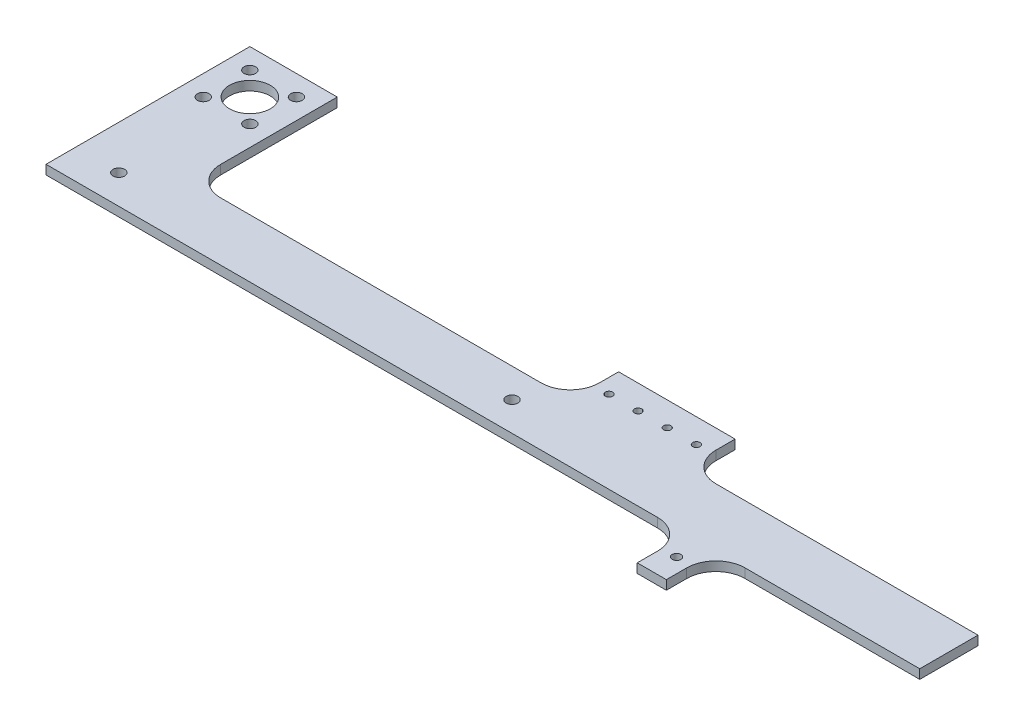
ISO-10303-21;
HEADER;
FILE_DESCRIPTION(('STEP AP214'),'2;1');
FILE_NAME('part.step','',(''),(''),'','','');
FILE_SCHEMA(('AUTOMOTIVE_DESIGN { 1 0 10303 214 1 1 1 1 }'));
ENDSEC;
DATA;
#1=APPLICATION_CONTEXT('core data for automotive mechanical design processes');
#2=APPLICATION_PROTOCOL_DEFINITION('international standard','automotive_design',2000,#1);
#3=PRODUCT_CONTEXT('',#1,'mechanical');
#4=PRODUCT('Part','Part','',(#3));
#5=PRODUCT_RELATED_PRODUCT_CATEGORY('part','',(#4));
#6=PRODUCT_DEFINITION_FORMATION('','',#4);
#7=PRODUCT_DEFINITION_CONTEXT('part definition',#1,'design');
#8=PRODUCT_DEFINITION('design','',#6,#7);
#9=PRODUCT_DEFINITION_SHAPE('','',#8);
#10=(LENGTH_UNIT() NAMED_UNIT(*) SI_UNIT(.MILLI.,.METRE.));
#11=(NAMED_UNIT(*) PLANE_ANGLE_UNIT() SI_UNIT($,.RADIAN.));
#12=(NAMED_UNIT(*) SI_UNIT($,.STERADIAN.) SOLID_ANGLE_UNIT());
#13=UNCERTAINTY_MEASURE_WITH_UNIT(LENGTH_MEASURE(1.E-05),#10,'distance_accuracy_value','');
#14=(GEOMETRIC_REPRESENTATION_CONTEXT(3) GLOBAL_UNCERTAINTY_ASSIGNED_CONTEXT((#13)) GLOBAL_UNIT_ASSIGNED_CONTEXT((#10,
#11,#12)) REPRESENTATION_CONTEXT('',''));
#15=CARTESIAN_POINT('',(0.,0.,0.));
#16=DIRECTION('',(0.,0.,1.));
#17=DIRECTION('',(1.,0.,0.));
#18=AXIS2_PLACEMENT_3D('',#15,#16,#17);
#19=CARTESIAN_POINT('',(230.,3.175,0.));
#20=DIRECTION('',(-1.,0.,0.));
#21=DIRECTION('',(0.,0.,1.));
#22=AXIS2_PLACEMENT_3D('',#19,#20,#21);
#23=PLANE('',#22);
#24=DIRECTION('',(0.,0.,-1.));
#25=VECTOR('',#24,1.);
#26=CARTESIAN_POINT('',(230.,0.,0.));
#27=LINE('',#26,#25);
#28=CARTESIAN_POINT('',(230.,0.,17.));
#29=VERTEX_POINT('',#28);
#30=CARTESIAN_POINT('',(230.,0.,10.));
#31=VERTEX_POINT('',#30);
#32=EDGE_CURVE('E289',#29,#31,#27,.T.);
#33=ORIENTED_EDGE('',*,*,#32,.T.);
#34=DIRECTION('',(0.,-1.,0.));
#35=VECTOR('',#34,1.);
#36=CARTESIAN_POINT('',(230.,3.175,10.));
#37=LINE('',#36,#35);
#38=CARTESIAN_POINT('',(230.,3.175,10.));
#39=VERTEX_POINT('',#38);
#40=EDGE_CURVE('E56',#31,#39,#37,.F.);
#41=ORIENTED_EDGE('',*,*,#40,.T.);
#42=DIRECTION('',(0.,0.,-1.));
#43=VECTOR('',#42,1.);
#44=CARTESIAN_POINT('',(230.,3.175,0.));
#45=LINE('',#44,#43);
#46=CARTESIAN_POINT('',(230.,3.175,17.));
#47=VERTEX_POINT('',#46);
#48=EDGE_CURVE('E224',#47,#39,#45,.T.);
#49=ORIENTED_EDGE('',*,*,#48,.F.);
#50=DIRECTION('',(0.,-1.,0.));
#51=VECTOR('',#50,1.);
#52=CARTESIAN_POINT('',(230.,3.175,17.));
#53=LINE('',#52,#51);
#54=EDGE_CURVE('E262',#47,#29,#53,.T.);
#55=ORIENTED_EDGE('',*,*,#54,.T.);
#56=EDGE_LOOP('',(#33,#41,#49,#55));
#57=FACE_BOUND('',#56,.T.);
#58=ADVANCED_FACE('F35',(#57),#23,.F.);
#59=CARTESIAN_POINT('',(200.,3.175,0.));
#60=DIRECTION('',(-1.,0.,0.));
#61=DIRECTION('',(0.,0.,1.));
#62=AXIS2_PLACEMENT_3D('',#59,#60,#61);
#63=PLANE('',#62);
#64=DIRECTION('',(0.,0.,-1.));
#65=VECTOR('',#64,1.);
#66=CARTESIAN_POINT('',(200.,3.175,0.));
#67=LINE('',#66,#65);
#68=CARTESIAN_POINT('',(200.,3.175,-30.));
#69=VERTEX_POINT('',#68);
#70=CARTESIAN_POINT('',(200.,3.175,-36.6));
#71=VERTEX_POINT('',#70);
#72=EDGE_CURVE('E197',#69,#71,#67,.T.);
#73=ORIENTED_EDGE('',*,*,#72,.F.);
#74=DIRECTION('',(0.,-1.,0.));
#75=VECTOR('',#74,1.);
#76=CARTESIAN_POINT('',(200.,3.175,-30.));
#77=LINE('',#76,#75);
#78=CARTESIAN_POINT('',(200.,0.,-30.));
#79=VERTEX_POINT('',#78);
#80=EDGE_CURVE('E348',#69,#79,#77,.T.);
#81=ORIENTED_EDGE('',*,*,#80,.T.);
#82=DIRECTION('',(0.,0.,-1.));
#83=VECTOR('',#82,1.);
#84=CARTESIAN_POINT('',(200.,0.,0.));
#85=LINE('',#84,#83);
#86=CARTESIAN_POINT('',(200.,0.,-36.6));
#87=VERTEX_POINT('',#86);
#88=EDGE_CURVE('E186',#79,#87,#85,.T.);
#89=ORIENTED_EDGE('',*,*,#88,.T.);
#90=DIRECTION('',(0.,-1.,0.));
#91=VECTOR('',#90,1.);
#92=CARTESIAN_POINT('',(200.,3.175,-36.6));
#93=LINE('',#92,#91);
#94=EDGE_CURVE('E340',#71,#87,#93,.T.);
#95=ORIENTED_EDGE('',*,*,#94,.F.);
#96=EDGE_LOOP('',(#73,#81,#89,#95));
#97=FACE_BOUND('',#96,.T.);
#98=ADVANCED_FACE('F395',(#97),#63,.F.);
#99=CARTESIAN_POINT('',(0.,3.175,-36.6));
#100=DIRECTION('',(0.,0.,1.));
#101=DIRECTION('',(1.,0.,0.));
#102=AXIS2_PLACEMENT_3D('',#99,#100,#101);
#103=PLANE('',#102);
#104=DIRECTION('',(-1.,0.,0.));
#105=VECTOR('',#104,1.);
#106=CARTESIAN_POINT('',(0.,0.,-36.6));
#107=LINE('',#106,#105);
#108=CARTESIAN_POINT('',(160.,0.,-36.6));
#109=VERTEX_POINT('',#108);
#110=EDGE_CURVE('E264',#87,#109,#107,.T.);
#111=ORIENTED_EDGE('',*,*,#110,.T.);
#112=DIRECTION('',(0.,-1.,0.));
#113=VECTOR('',#112,1.);
#114=CARTESIAN_POINT('',(160.,3.175,-36.6));
#115=LINE('',#114,#113);
#116=CARTESIAN_POINT('',(160.,3.175,-36.6));
#117=VERTEX_POINT('',#116);
#118=EDGE_CURVE('E337',#117,#109,#115,.T.);
#119=ORIENTED_EDGE('',*,*,#118,.F.);
#120=DIRECTION('',(-1.,0.,0.));
#121=VECTOR('',#120,1.);
#122=CARTESIAN_POINT('',(0.,3.175,-36.6));
#123=LINE('',#122,#121);
#124=EDGE_CURVE('E199',#71,#117,#123,.T.);
#125=ORIENTED_EDGE('',*,*,#124,.F.);
#126=ORIENTED_EDGE('',*,*,#94,.T.);
#127=EDGE_LOOP('',(#111,#119,#125,#126));
#128=FACE_BOUND('',#127,.T.);
#129=ADVANCED_FACE('F402',(#128),#103,.F.);
#130=CARTESIAN_POINT('',(160.,3.175,0.));
#131=DIRECTION('',(1.,0.,0.));
#132=DIRECTION('',(0.,0.,-1.));
#133=AXIS2_PLACEMENT_3D('',#130,#131,#132);
#134=PLANE('',#133);
#135=DIRECTION('',(0.,0.,1.));
#136=VECTOR('',#135,1.);
#137=CARTESIAN_POINT('',(160.,0.,0.));
#138=LINE('',#137,#136);
#139=CARTESIAN_POINT('',(160.,0.,-30.));
#140=VERTEX_POINT('',#139);
#141=EDGE_CURVE('E266',#109,#140,#138,.T.);
#142=ORIENTED_EDGE('',*,*,#141,.T.);
#143=DIRECTION('',(0.,-1.,0.));
#144=VECTOR('',#143,1.);
#145=CARTESIAN_POINT('',(160.,3.175,-30.));
#146=LINE('',#145,#144);
#147=CARTESIAN_POINT('',(160.,3.175,-30.));
#148=VERTEX_POINT('',#147);
#149=EDGE_CURVE('E358',#140,#148,#146,.F.);
#150=ORIENTED_EDGE('',*,*,#149,.T.);
#151=DIRECTION('',(0.,0.,1.));
#152=VECTOR('',#151,1.);
#153=CARTESIAN_POINT('',(160.,3.175,0.));
#154=LINE('',#153,#152);
#155=EDGE_CURVE('E202',#117,#148,#154,.T.);
#156=ORIENTED_EDGE('',*,*,#155,.F.);
#157=ORIENTED_EDGE('',*,*,#118,.T.);
#158=EDGE_LOOP('',(#142,#150,#156,#157));
#159=FACE_BOUND('',#158,.T.);
#160=ADVANCED_FACE('F480',(#159),#134,.F.);
#161=CARTESIAN_POINT('',(0.,3.175,-20.));
#162=DIRECTION('',(0.,0.,-1.));
#163=DIRECTION('',(-1.,0.,0.));
#164=AXIS2_PLACEMENT_3D('',#161,#162,#163);
#165=PLANE('',#164);
#166=DIRECTION('',(1.,0.,0.));
#167=VECTOR('',#166,1.);
#168=CARTESIAN_POINT('',(0.,3.175,-20.));
#169=LINE('',#168,#167);
#170=CARTESIAN_POINT('',(40.,3.175,-20.));
#171=VERTEX_POINT('',#170);
#172=CARTESIAN_POINT('',(150.,3.175,-20.));
#173=VERTEX_POINT('',#172);
#174=EDGE_CURVE('E205',#171,#173,#169,.T.);
#175=ORIENTED_EDGE('',*,*,#174,.T.);
#176=DIRECTION('',(0.,-1.,0.));
#177=VECTOR('',#176,1.);
#178=CARTESIAN_POINT('',(150.,3.175,-20.));
#179=LINE('',#178,#177);
#180=CARTESIAN_POINT('',(150.,0.,-20.));
#181=VERTEX_POINT('',#180);
#182=EDGE_CURVE('E355',#173,#181,#179,.T.);
#183=ORIENTED_EDGE('',*,*,#182,.T.);
#184=DIRECTION('',(1.,0.,0.));
#185=VECTOR('',#184,1.);
#186=CARTESIAN_POINT('',(0.,0.,-20.));
#187=LINE('',#186,#185);
#188=CARTESIAN_POINT('',(40.,0.,-20.));
#189=VERTEX_POINT('',#188);
#190=EDGE_CURVE('E269',#189,#181,#187,.T.);
#191=ORIENTED_EDGE('',*,*,#190,.F.);
#192=DIRECTION('',(0.,-1.,0.));
#193=VECTOR('',#192,1.);
#194=CARTESIAN_POINT('',(40.,3.175,-20.));
#195=LINE('',#194,#193);
#196=EDGE_CURVE('E353',#189,#171,#195,.F.);
#197=ORIENTED_EDGE('',*,*,#196,.T.);
#198=EDGE_LOOP('',(#175,#183,#191,#197));
#199=FACE_BOUND('',#198,.T.);
#200=ADVANCED_FACE('F413',(#199),#165,.T.);
#201=CARTESIAN_POINT('',(30.,3.175,0.));
#202=DIRECTION('',(-1.,0.,0.));
#203=DIRECTION('',(0.,0.,1.));
#204=AXIS2_PLACEMENT_3D('',#201,#202,#203);
#205=PLANE('',#204);
#206=DIRECTION('',(0.,0.,-1.));
#207=VECTOR('',#206,1.);
#208=CARTESIAN_POINT('',(30.,3.175,0.));
#209=LINE('',#208,#207);
#210=CARTESIAN_POINT('',(30.,3.175,-30.));
#211=VERTEX_POINT('',#210);
#212=CARTESIAN_POINT('',(30.,3.175,-70.));
#213=VERTEX_POINT('',#212);
#214=EDGE_CURVE('E208',#211,#213,#209,.T.);
#215=ORIENTED_EDGE('',*,*,#214,.F.);
#216=DIRECTION('',(0.,-1.,0.));
#217=VECTOR('',#216,1.);
#218=CARTESIAN_POINT('',(30.,3.175,-30.));
#219=LINE('',#218,#217);
#220=CARTESIAN_POINT('',(30.,0.,-30.));
#221=VERTEX_POINT('',#220);
#222=EDGE_CURVE('E360',#211,#221,#219,.T.);
#223=ORIENTED_EDGE('',*,*,#222,.T.);
#224=DIRECTION('',(0.,0.,-1.));
#225=VECTOR('',#224,1.);
#226=CARTESIAN_POINT('',(30.,0.,0.));
#227=LINE('',#226,#225);
#228=CARTESIAN_POINT('',(30.,0.,-70.));
#229=VERTEX_POINT('',#228);
#230=EDGE_CURVE('E272',#221,#229,#227,.T.);
#231=ORIENTED_EDGE('',*,*,#230,.T.);
#232=DIRECTION('',(0.,-1.,0.));
#233=VECTOR('',#232,1.);
#234=CARTESIAN_POINT('',(30.,3.175,-70.));
#235=LINE('',#234,#233);
#236=EDGE_CURVE('E334',#213,#229,#235,.T.);
#237=ORIENTED_EDGE('',*,*,#236,.F.);
#238=EDGE_LOOP('',(#215,#223,#231,#237));
#239=FACE_BOUND('',#238,.T.);
#240=ADVANCED_FACE('F423',(#239),#205,.F.);
#241=CARTESIAN_POINT('',(0.,3.175,-70.));
#242=DIRECTION('',(0.,0.,1.));
#243=DIRECTION('',(1.,0.,0.));
#244=AXIS2_PLACEMENT_3D('',#241,#242,#243);
#245=PLANE('',#244);
#246=DIRECTION('',(-1.,0.,0.));
#247=VECTOR('',#246,1.);
#248=CARTESIAN_POINT('',(0.,0.,-70.));
#249=LINE('',#248,#247);
#250=CARTESIAN_POINT('',(0.,0.,-70.));
#251=VERTEX_POINT('',#250);
#252=EDGE_CURVE('E275',#229,#251,#249,.T.);
#253=ORIENTED_EDGE('',*,*,#252,.T.);
#254=DIRECTION('',(0.,-1.,0.));
#255=VECTOR('',#254,1.);
#256=CARTESIAN_POINT('',(0.,3.175,-70.));
#257=LINE('',#256,#255);
#258=CARTESIAN_POINT('',(0.,3.175,-70.));
#259=VERTEX_POINT('',#258);
#260=EDGE_CURVE('E332',#259,#251,#257,.T.);
#261=ORIENTED_EDGE('',*,*,#260,.F.);
#262=DIRECTION('',(-1.,0.,0.));
#263=VECTOR('',#262,1.);
#264=CARTESIAN_POINT('',(0.,3.175,-70.));
#265=LINE('',#264,#263);
#266=EDGE_CURVE('E211',#213,#259,#265,.T.);
#267=ORIENTED_EDGE('',*,*,#266,.F.);
#268=ORIENTED_EDGE('',*,*,#236,.T.);
#269=EDGE_LOOP('',(#253,#261,#267,#268));
#270=FACE_BOUND('',#269,.T.);
#271=ADVANCED_FACE('F429',(#270),#245,.F.);
#272=CARTESIAN_POINT('',(0.,3.175,0.));
#273=DIRECTION('',(-1.,0.,0.));
#274=DIRECTION('',(0.,0.,1.));
#275=AXIS2_PLACEMENT_3D('',#272,#273,#274);
#276=PLANE('',#275);
#277=DIRECTION('',(0.,0.,-1.));
#278=VECTOR('',#277,1.);
#279=CARTESIAN_POINT('',(0.,0.,0.));
#280=LINE('',#279,#278);
#281=CARTESIAN_POINT('',(0.,0.,0.));
#282=VERTEX_POINT('',#281);
#283=EDGE_CURVE('E278',#282,#251,#280,.T.);
#284=ORIENTED_EDGE('',*,*,#283,.F.);
#285=DIRECTION('',(0.,-1.,0.));
#286=VECTOR('',#285,1.);
#287=CARTESIAN_POINT('',(0.,3.175,0.));
#288=LINE('',#287,#286);
#289=CARTESIAN_POINT('',(0.,3.175,0.));
#290=VERTEX_POINT('',#289);
#291=EDGE_CURVE('E330',#290,#282,#288,.T.);
#292=ORIENTED_EDGE('',*,*,#291,.F.);
#293=DIRECTION('',(0.,0.,-1.));
#294=VECTOR('',#293,1.);
#295=CARTESIAN_POINT('',(0.,3.175,0.));
#296=LINE('',#295,#294);
#297=EDGE_CURVE('E213',#290,#259,#296,.T.);
#298=ORIENTED_EDGE('',*,*,#297,.T.);
#299=ORIENTED_EDGE('',*,*,#260,.T.);
#300=EDGE_LOOP('',(#284,#292,#298,#299));
#301=FACE_BOUND('',#300,.T.);
#302=ADVANCED_FACE('F432',(#301),#276,.T.);
#303=CARTESIAN_POINT('',(0.,3.175,0.));
#304=DIRECTION('',(0.,0.,-1.));
#305=DIRECTION('',(-1.,0.,0.));
#306=AXIS2_PLACEMENT_3D('',#303,#304,#305);
#307=PLANE('',#306);
#308=DIRECTION('',(1.,0.,0.));
#309=VECTOR('',#308,1.);
#310=CARTESIAN_POINT('',(0.,0.,0.));
#311=LINE('',#310,#309);
#312=CARTESIAN_POINT('',(210.,0.,0.));
#313=VERTEX_POINT('',#312);
#314=EDGE_CURVE('E281',#282,#313,#311,.T.);
#315=ORIENTED_EDGE('',*,*,#314,.T.);
#316=DIRECTION('',(0.,-1.,0.));
#317=VECTOR('',#316,1.);
#318=CARTESIAN_POINT('',(210.,3.175,0.));
#319=LINE('',#318,#317);
#320=CARTESIAN_POINT('',(210.,3.175,0.));
#321=VERTEX_POINT('',#320);
#322=EDGE_CURVE('E346',#313,#321,#319,.F.);
#323=ORIENTED_EDGE('',*,*,#322,.T.);
#324=DIRECTION('',(1.,0.,0.));
#325=VECTOR('',#324,1.);
#326=CARTESIAN_POINT('',(0.,3.175,0.));
#327=LINE('',#326,#325);
#328=EDGE_CURVE('E216',#290,#321,#327,.T.);
#329=ORIENTED_EDGE('',*,*,#328,.F.);
#330=ORIENTED_EDGE('',*,*,#291,.T.);
#331=EDGE_LOOP('',(#315,#323,#329,#330));
#332=FACE_BOUND('',#331,.T.);
#333=ADVANCED_FACE('F436',(#332),#307,.F.);
#334=CARTESIAN_POINT('',(220.,3.175,0.));
#335=DIRECTION('',(1.,0.,0.));
#336=DIRECTION('',(0.,0.,-1.));
#337=AXIS2_PLACEMENT_3D('',#334,#335,#336);
#338=PLANE('',#337);
#339=DIRECTION('',(0.,0.,1.));
#340=VECTOR('',#339,1.);
#341=CARTESIAN_POINT('',(220.,3.175,0.));
#342=LINE('',#341,#340);
#343=CARTESIAN_POINT('',(220.,3.175,10.));
#344=VERTEX_POINT('',#343);
#345=CARTESIAN_POINT('',(220.,3.175,17.));
#346=VERTEX_POINT('',#345);
#347=EDGE_CURVE('E219',#344,#346,#342,.T.);
#348=ORIENTED_EDGE('',*,*,#347,.F.);
#349=DIRECTION('',(0.,-1.,0.));
#350=VECTOR('',#349,1.);
#351=CARTESIAN_POINT('',(220.,0.,10.));
#352=LINE('',#351,#350);
#353=CARTESIAN_POINT('',(220.,0.,10.));
#354=VERTEX_POINT('',#353);
#355=EDGE_CURVE('E343',#344,#354,#352,.T.);
#356=ORIENTED_EDGE('',*,*,#355,.T.);
#357=DIRECTION('',(0.,0.,1.));
#358=VECTOR('',#357,1.);
#359=CARTESIAN_POINT('',(220.,0.,0.));
#360=LINE('',#359,#358);
#361=CARTESIAN_POINT('',(220.,0.,17.));
#362=VERTEX_POINT('',#361);
#363=EDGE_CURVE('E284',#354,#362,#360,.T.);
#364=ORIENTED_EDGE('',*,*,#363,.T.);
#365=DIRECTION('',(0.,-1.,0.));
#366=VECTOR('',#365,1.);
#367=CARTESIAN_POINT('',(220.,3.175,17.));
#368=LINE('',#367,#366);
#369=EDGE_CURVE('E327',#346,#362,#368,.T.);
#370=ORIENTED_EDGE('',*,*,#369,.F.);
#371=EDGE_LOOP('',(#348,#356,#364,#370));
#372=FACE_BOUND('',#371,.T.);
#373=ADVANCED_FACE('F445',(#372),#338,.F.);
#374=CARTESIAN_POINT('',(0.,3.175,17.));
#375=DIRECTION('',(0.,0.,1.));
#376=DIRECTION('',(1.,0.,0.));
#377=AXIS2_PLACEMENT_3D('',#374,#375,#376);
#378=PLANE('',#377);
#379=DIRECTION('',(-1.,0.,0.));
#380=VECTOR('',#379,1.);
#381=CARTESIAN_POINT('',(0.,0.,17.));
#382=LINE('',#381,#380);
#383=EDGE_CURVE('E286',#29,#362,#382,.T.);
#384=ORIENTED_EDGE('',*,*,#383,.F.);
#385=ORIENTED_EDGE('',*,*,#54,.F.);
#386=DIRECTION('',(-1.,0.,0.));
#387=VECTOR('',#386,1.);
#388=CARTESIAN_POINT('',(0.,3.175,17.));
#389=LINE('',#388,#387);
#390=EDGE_CURVE('E221',#47,#346,#389,.T.);
#391=ORIENTED_EDGE('',*,*,#390,.T.);
#392=ORIENTED_EDGE('',*,*,#369,.T.);
#393=EDGE_LOOP('',(#384,#385,#391,#392));
#394=FACE_BOUND('',#393,.T.);
#395=ADVANCED_FACE('F449',(#394),#378,.T.);
#396=CARTESIAN_POINT('',(22.9999999999926,3.175,-46.9999999999928));
#397=DIRECTION('',(0.,-1.,0.));
#398=DIRECTION('',(0.,0.,-1.));
#399=AXIS2_PLACEMENT_3D('',#396,#397,#398);
#400=CYLINDRICAL_SURFACE('',#399,2.0000000000053);
#401=CARTESIAN_POINT('',(22.9999999999926,3.175,-46.9999999999928));
#402=DIRECTION('',(0.,1.,0.));
#403=DIRECTION('',(0.,0.,1.));
#404=AXIS2_PLACEMENT_3D('',#401,#402,#403);
#405=CIRCLE('',#404,2.0000000000053);
#406=CARTESIAN_POINT('',(22.9999999999926,3.175,-44.9999999999875));
#407=VERTEX_POINT('',#406);
#408=EDGE_CURVE('E256',#407,#407,#405,.T.);
#409=ORIENTED_EDGE('',*,*,#408,.T.);
#410=EDGE_LOOP('',(#409));
#411=FACE_BOUND('',#410,.T.);
#412=CARTESIAN_POINT('',(22.9999999999926,0.,-46.9999999999928));
#413=DIRECTION('',(0.,1.,0.));
#414=DIRECTION('',(0.,0.,1.));
#415=AXIS2_PLACEMENT_3D('',#412,#413,#414);
#416=CIRCLE('',#415,2.0000000000053);
#417=CARTESIAN_POINT('',(22.9999999999926,0.,-44.9999999999875));
#418=VERTEX_POINT('',#417);
#419=EDGE_CURVE('E321',#418,#418,#416,.T.);
#420=ORIENTED_EDGE('',*,*,#419,.F.);
#421=EDGE_LOOP('',(#420));
#422=FACE_BOUND('',#421,.T.);
#423=ADVANCED_FACE('F469',(#411,#422),#400,.F.);
#424=CARTESIAN_POINT('',(22.9999999999838,3.175,-62.9999999999928));
#425=DIRECTION('',(0.,-1.,0.));
#426=DIRECTION('',(0.,0.,-1.));
#427=AXIS2_PLACEMENT_3D('',#424,#425,#426);
#428=CYLINDRICAL_SURFACE('',#427,1.99999999998661);
#429=CARTESIAN_POINT('',(22.9999999999838,3.175,-62.9999999999928));
#430=DIRECTION('',(0.,1.,0.));
#431=DIRECTION('',(0.,0.,1.));
#432=AXIS2_PLACEMENT_3D('',#429,#430,#431);
#433=CIRCLE('',#432,1.99999999998661);
#434=CARTESIAN_POINT('',(22.9999999999838,3.175,-61.0000000000062));
#435=VERTEX_POINT('',#434);
#436=EDGE_CURVE('E253',#435,#435,#433,.T.);
#437=ORIENTED_EDGE('',*,*,#436,.T.);
#438=EDGE_LOOP('',(#437));
#439=FACE_BOUND('',#438,.T.);
#440=CARTESIAN_POINT('',(22.9999999999838,0.,-62.9999999999928));
#441=DIRECTION('',(0.,1.,0.));
#442=DIRECTION('',(0.,0.,1.));
#443=AXIS2_PLACEMENT_3D('',#440,#441,#442);
#444=CIRCLE('',#443,1.99999999998661);
#445=CARTESIAN_POINT('',(22.9999999999838,0.,-61.0000000000062));
#446=VERTEX_POINT('',#445);
#447=EDGE_CURVE('E318',#446,#446,#444,.T.);
#448=ORIENTED_EDGE('',*,*,#447,.F.);
#449=EDGE_LOOP('',(#448));
#450=FACE_BOUND('',#449,.T.);
#451=ADVANCED_FACE('F508',(#439,#450),#428,.F.);
#452=CARTESIAN_POINT('',(6.99999999999263,3.175,-62.9999999999927));
#453=DIRECTION('',(0.,-1.,0.));
#454=DIRECTION('',(0.,0.,-1.));
#455=AXIS2_PLACEMENT_3D('',#452,#453,#454);
#456=CYLINDRICAL_SURFACE('',#455,1.99999999998665);
#457=CARTESIAN_POINT('',(6.99999999999263,3.175,-62.9999999999927));
#458=DIRECTION('',(0.,1.,0.));
#459=DIRECTION('',(0.,0.,1.));
#460=AXIS2_PLACEMENT_3D('',#457,#458,#459);
#461=CIRCLE('',#460,1.99999999998665);
#462=CARTESIAN_POINT('',(6.99999999999263,3.175,-61.000000000006));
#463=VERTEX_POINT('',#462);
#464=EDGE_CURVE('E250',#463,#463,#461,.T.);
#465=ORIENTED_EDGE('',*,*,#464,.T.);
#466=EDGE_LOOP('',(#465));
#467=FACE_BOUND('',#466,.T.);
#468=CARTESIAN_POINT('',(6.99999999999263,0.,-62.9999999999927));
#469=DIRECTION('',(0.,1.,0.));
#470=DIRECTION('',(0.,0.,1.));
#471=AXIS2_PLACEMENT_3D('',#468,#469,#470);
#472=CIRCLE('',#471,1.99999999998665);
#473=CARTESIAN_POINT('',(6.99999999999263,0.,-61.000000000006));
#474=VERTEX_POINT('',#473);
#475=EDGE_CURVE('E315',#474,#474,#472,.T.);
#476=ORIENTED_EDGE('',*,*,#475,.F.);
#477=EDGE_LOOP('',(#476));
#478=FACE_BOUND('',#477,.T.);
#479=ADVANCED_FACE('F512',(#467,#478),#456,.F.);
#480=CARTESIAN_POINT('',(15.,3.175,-55.));
#481=DIRECTION('',(0.,-1.,0.));
#482=DIRECTION('',(0.,0.,-1.));
#483=AXIS2_PLACEMENT_3D('',#480,#481,#482);
#484=CYLINDRICAL_SURFACE('',#483,6.99999999997114);
#485=CARTESIAN_POINT('',(15.,3.175,-55.));
#486=DIRECTION('',(0.,1.,0.));
#487=DIRECTION('',(0.,0.,1.));
#488=AXIS2_PLACEMENT_3D('',#485,#486,#487);
#489=CIRCLE('',#488,6.99999999997114);
#490=CARTESIAN_POINT('',(15.,3.175,-48.0000000000289));
#491=VERTEX_POINT('',#490);
#492=EDGE_CURVE('E247',#491,#491,#489,.T.);
#493=ORIENTED_EDGE('',*,*,#492,.T.);
#494=EDGE_LOOP('',(#493));
#495=FACE_BOUND('',#494,.T.);
#496=CARTESIAN_POINT('',(15.,0.,-55.));
#497=DIRECTION('',(0.,1.,0.));
#498=DIRECTION('',(0.,0.,1.));
#499=AXIS2_PLACEMENT_3D('',#496,#497,#498);
#500=CIRCLE('',#499,6.99999999997114);
#501=CARTESIAN_POINT('',(15.,0.,-48.0000000000289));
#502=VERTEX_POINT('',#501);
#503=EDGE_CURVE('E312',#502,#502,#500,.T.);
#504=ORIENTED_EDGE('',*,*,#503,.F.);
#505=EDGE_LOOP('',(#504));
#506=FACE_BOUND('',#505,.T.);
#507=ADVANCED_FACE('F516',(#495,#506),#484,.F.);
#508=CARTESIAN_POINT('',(185.,3.175,-28.2999999999999));
#509=DIRECTION('',(0.,-1.,0.));
#510=DIRECTION('',(0.,0.,-1.));
#511=AXIS2_PLACEMENT_3D('',#508,#509,#510);
#512=CYLINDRICAL_SURFACE('',#511,1.25000000000001);
#513=CARTESIAN_POINT('',(185.,3.175,-28.2999999999999));
#514=DIRECTION('',(0.,1.,0.));
#515=DIRECTION('',(0.,0.,1.));
#516=AXIS2_PLACEMENT_3D('',#513,#514,#515);
#517=CIRCLE('',#516,1.25000000000001);
#518=CARTESIAN_POINT('',(185.,3.175,-27.0499999999999));
#519=VERTEX_POINT('',#518);
#520=EDGE_CURVE('E244',#519,#519,#517,.T.);
#521=ORIENTED_EDGE('',*,*,#520,.T.);
#522=EDGE_LOOP('',(#521));
#523=FACE_BOUND('',#522,.T.);
#524=CARTESIAN_POINT('',(185.,0.,-28.2999999999999));
#525=DIRECTION('',(0.,1.,0.));
#526=DIRECTION('',(0.,0.,1.));
#527=AXIS2_PLACEMENT_3D('',#524,#525,#526);
#528=CIRCLE('',#527,1.25000000000001);
#529=CARTESIAN_POINT('',(185.,0.,-27.0499999999999));
#530=VERTEX_POINT('',#529);
#531=EDGE_CURVE('E309',#530,#530,#528,.T.);
#532=ORIENTED_EDGE('',*,*,#531,.F.);
#533=EDGE_LOOP('',(#532));
#534=FACE_BOUND('',#533,.T.);
#535=ADVANCED_FACE('F520',(#523,#534),#512,.F.);
#536=CARTESIAN_POINT('',(175.,3.175,-28.2999999999999));
#537=DIRECTION('',(0.,-1.,0.));
#538=DIRECTION('',(0.,0.,-1.));
#539=AXIS2_PLACEMENT_3D('',#536,#537,#538);
#540=CYLINDRICAL_SURFACE('',#539,1.25000000000001);
#541=CARTESIAN_POINT('',(175.,3.175,-28.2999999999999));
#542=DIRECTION('',(0.,1.,0.));
#543=DIRECTION('',(0.,0.,1.));
#544=AXIS2_PLACEMENT_3D('',#541,#542,#543);
#545=CIRCLE('',#544,1.25000000000001);
#546=CARTESIAN_POINT('',(175.,3.175,-27.0499999999999));
#547=VERTEX_POINT('',#546);
#548=EDGE_CURVE('E241',#547,#547,#545,.T.);
#549=ORIENTED_EDGE('',*,*,#548,.T.);
#550=EDGE_LOOP('',(#549));
#551=FACE_BOUND('',#550,.T.);
#552=CARTESIAN_POINT('',(175.,0.,-28.2999999999999));
#553=DIRECTION('',(0.,1.,0.));
#554=DIRECTION('',(0.,0.,1.));
#555=AXIS2_PLACEMENT_3D('',#552,#553,#554);
#556=CIRCLE('',#555,1.25000000000001);
#557=CARTESIAN_POINT('',(175.,0.,-27.0499999999999));
#558=VERTEX_POINT('',#557);
#559=EDGE_CURVE('E306',#558,#558,#556,.T.);
#560=ORIENTED_EDGE('',*,*,#559,.F.);
#561=EDGE_LOOP('',(#560));
#562=FACE_BOUND('',#561,.T.);
#563=ADVANCED_FACE('F524',(#551,#562),#540,.F.);
#564=CARTESIAN_POINT('',(165.,3.175,-28.2999999999998));
#565=DIRECTION('',(0.,-1.,0.));
#566=DIRECTION('',(0.,0.,-1.));
#567=AXIS2_PLACEMENT_3D('',#564,#565,#566);
#568=CYLINDRICAL_SURFACE('',#567,1.25000000000001);
#569=CARTESIAN_POINT('',(165.,3.175,-28.2999999999998));
#570=DIRECTION('',(0.,1.,0.));
#571=DIRECTION('',(0.,0.,1.));
#572=AXIS2_PLACEMENT_3D('',#569,#570,#571);
#573=CIRCLE('',#572,1.25000000000001);
#574=CARTESIAN_POINT('',(165.,3.175,-27.0499999999998));
#575=VERTEX_POINT('',#574);
#576=EDGE_CURVE('E238',#575,#575,#573,.T.);
#577=ORIENTED_EDGE('',*,*,#576,.T.);
#578=EDGE_LOOP('',(#577));
#579=FACE_BOUND('',#578,.T.);
#580=CARTESIAN_POINT('',(165.,0.,-28.2999999999998));
#581=DIRECTION('',(0.,1.,0.));
#582=DIRECTION('',(0.,0.,1.));
#583=AXIS2_PLACEMENT_3D('',#580,#581,#582);
#584=CIRCLE('',#583,1.25000000000001);
#585=CARTESIAN_POINT('',(165.,0.,-27.0499999999998));
#586=VERTEX_POINT('',#585);
#587=EDGE_CURVE('E303',#586,#586,#584,.T.);
#588=ORIENTED_EDGE('',*,*,#587,.F.);
#589=EDGE_LOOP('',(#588));
#590=FACE_BOUND('',#589,.T.);
#591=ADVANCED_FACE('F528',(#579,#590),#568,.F.);
#592=CARTESIAN_POINT('',(195.,3.175,-28.3));
#593=DIRECTION('',(0.,-1.,0.));
#594=DIRECTION('',(0.,0.,-1.));
#595=AXIS2_PLACEMENT_3D('',#592,#593,#594);
#596=CYLINDRICAL_SURFACE('',#595,1.25000000000001);
#597=CARTESIAN_POINT('',(195.,3.175,-28.3));
#598=DIRECTION('',(0.,1.,0.));
#599=DIRECTION('',(0.,0.,1.));
#600=AXIS2_PLACEMENT_3D('',#597,#598,#599);
#601=CIRCLE('',#600,1.25000000000001);
#602=CARTESIAN_POINT('',(195.,3.175,-27.05));
#603=VERTEX_POINT('',#602);
#604=EDGE_CURVE('E235',#603,#603,#601,.T.);
#605=ORIENTED_EDGE('',*,*,#604,.T.);
#606=EDGE_LOOP('',(#605));
#607=FACE_BOUND('',#606,.T.);
#608=CARTESIAN_POINT('',(195.,0.,-28.3));
#609=DIRECTION('',(0.,1.,0.));
#610=DIRECTION('',(0.,0.,1.));
#611=AXIS2_PLACEMENT_3D('',#608,#609,#610);
#612=CIRCLE('',#611,1.25000000000001);
#613=CARTESIAN_POINT('',(195.,0.,-27.05));
#614=VERTEX_POINT('',#613);
#615=EDGE_CURVE('E300',#614,#614,#612,.T.);
#616=ORIENTED_EDGE('',*,*,#615,.F.);
#617=EDGE_LOOP('',(#616));
#618=FACE_BOUND('',#617,.T.);
#619=ADVANCED_FACE('F532',(#607,#618),#596,.F.);
#620=CARTESIAN_POINT('',(225.,3.175,8.49999999999999));
#621=DIRECTION('',(0.,-1.,0.));
#622=DIRECTION('',(0.,0.,-1.));
#623=AXIS2_PLACEMENT_3D('',#620,#621,#622);
#624=CYLINDRICAL_SURFACE('',#623,1.5);
#625=CARTESIAN_POINT('',(225.,3.175,8.49999999999999));
#626=DIRECTION('',(0.,1.,0.));
#627=DIRECTION('',(0.,0.,1.));
#628=AXIS2_PLACEMENT_3D('',#625,#626,#627);
#629=CIRCLE('',#628,1.5);
#630=CARTESIAN_POINT('',(225.,3.175,9.99999999999999));
#631=VERTEX_POINT('',#630);
#632=EDGE_CURVE('E232',#631,#631,#629,.T.);
#633=ORIENTED_EDGE('',*,*,#632,.T.);
#634=EDGE_LOOP('',(#633));
#635=FACE_BOUND('',#634,.T.);
#636=CARTESIAN_POINT('',(225.,0.,8.49999999999999));
#637=DIRECTION('',(0.,1.,0.));
#638=DIRECTION('',(0.,0.,1.));
#639=AXIS2_PLACEMENT_3D('',#636,#637,#638);
#640=CIRCLE('',#639,1.5);
#641=CARTESIAN_POINT('',(225.,0.,9.99999999999999));
#642=VERTEX_POINT('',#641);
#643=EDGE_CURVE('E297',#642,#642,#640,.T.);
#644=ORIENTED_EDGE('',*,*,#643,.F.);
#645=EDGE_LOOP('',(#644));
#646=FACE_BOUND('',#645,.T.);
#647=ADVANCED_FACE('F536',(#635,#646),#624,.F.);
#648=CARTESIAN_POINT('',(150.,3.175,-10.));
#649=DIRECTION('',(0.,-1.,0.));
#650=DIRECTION('',(0.,0.,-1.));
#651=AXIS2_PLACEMENT_3D('',#648,#649,#650);
#652=CYLINDRICAL_SURFACE('',#651,2.);
#653=CARTESIAN_POINT('',(150.,3.175,-10.));
#654=DIRECTION('',(0.,1.,0.));
#655=DIRECTION('',(0.,0.,1.));
#656=AXIS2_PLACEMENT_3D('',#653,#654,#655);
#657=CIRCLE('',#656,2.);
#658=CARTESIAN_POINT('',(150.,3.175,-8.00000000000001));
#659=VERTEX_POINT('',#658);
#660=EDGE_CURVE('E229',#659,#659,#657,.T.);
#661=ORIENTED_EDGE('',*,*,#660,.T.);
#662=EDGE_LOOP('',(#661));
#663=FACE_BOUND('',#662,.T.);
#664=CARTESIAN_POINT('',(150.,0.,-10.));
#665=DIRECTION('',(0.,1.,0.));
#666=DIRECTION('',(0.,0.,1.));
#667=AXIS2_PLACEMENT_3D('',#664,#665,#666);
#668=CIRCLE('',#667,2.);
#669=CARTESIAN_POINT('',(150.,0.,-8.00000000000001));
#670=VERTEX_POINT('',#669);
#671=EDGE_CURVE('E294',#670,#670,#668,.T.);
#672=ORIENTED_EDGE('',*,*,#671,.F.);
#673=EDGE_LOOP('',(#672));
#674=FACE_BOUND('',#673,.T.);
#675=ADVANCED_FACE('F540',(#663,#674),#652,.F.);
#676=CARTESIAN_POINT('',(15.,3.175,-9.99999999999998));
#677=DIRECTION('',(0.,-1.,0.));
#678=DIRECTION('',(0.,0.,-1.));
#679=AXIS2_PLACEMENT_3D('',#676,#677,#678);
#680=CYLINDRICAL_SURFACE('',#679,2.);
#681=CARTESIAN_POINT('',(15.,3.175,-9.99999999999998));
#682=DIRECTION('',(0.,1.,0.));
#683=DIRECTION('',(0.,0.,1.));
#684=AXIS2_PLACEMENT_3D('',#681,#682,#683);
#685=CIRCLE('',#684,2.);
#686=CARTESIAN_POINT('',(15.,3.175,-7.99999999999997));
#687=VERTEX_POINT('',#686);
#688=EDGE_CURVE('E226',#687,#687,#685,.T.);
#689=ORIENTED_EDGE('',*,*,#688,.T.);
#690=EDGE_LOOP('',(#689));
#691=FACE_BOUND('',#690,.T.);
#692=CARTESIAN_POINT('',(15.,0.,-9.99999999999998));
#693=DIRECTION('',(0.,1.,0.));
#694=DIRECTION('',(0.,0.,1.));
#695=AXIS2_PLACEMENT_3D('',#692,#693,#694);
#696=CIRCLE('',#695,2.);
#697=CARTESIAN_POINT('',(15.,0.,-7.99999999999997));
#698=VERTEX_POINT('',#697);
#699=EDGE_CURVE('E291',#698,#698,#696,.T.);
#700=ORIENTED_EDGE('',*,*,#699,.F.);
#701=EDGE_LOOP('',(#700));
#702=FACE_BOUND('',#701,.T.);
#703=ADVANCED_FACE('F543',(#691,#702),#680,.F.);
#704=CARTESIAN_POINT('',(210.,0.,-20.));
#705=VERTEX_POINT('',#704);
#706=CARTESIAN_POINT('',(300.,0.,-20.));
#707=VERTEX_POINT('',#706);
#708=EDGE_CURVE('E273',#705,#707,#187,.T.);
#709=ORIENTED_EDGE('',*,*,#708,.F.);
#710=DIRECTION('',(0.,-1.,0.));
#711=VECTOR('',#710,1.);
#712=CARTESIAN_POINT('',(210.,3.175,-20.));
#713=LINE('',#712,#711);
#714=CARTESIAN_POINT('',(210.,3.175,-20.));
#715=VERTEX_POINT('',#714);
#716=EDGE_CURVE('E351',#705,#715,#713,.F.);
#717=ORIENTED_EDGE('',*,*,#716,.T.);
#718=CARTESIAN_POINT('',(300.,3.175,-20.));
#719=VERTEX_POINT('',#718);
#720=EDGE_CURVE('E209',#715,#719,#169,.T.);
#721=ORIENTED_EDGE('',*,*,#720,.T.);
#722=DIRECTION('',(0.,-1.,0.));
#723=VECTOR('',#722,1.);
#724=CARTESIAN_POINT('',(300.,3.175,-20.));
#725=LINE('',#724,#723);
#726=EDGE_CURVE('E187',#719,#707,#725,.T.);
#727=ORIENTED_EDGE('',*,*,#726,.T.);
#728=EDGE_LOOP('',(#709,#717,#721,#727));
#729=FACE_BOUND('',#728,.T.);
#730=ADVANCED_FACE('F388',(#729),#165,.T.);
#731=CARTESIAN_POINT('',(6.99999999999263,3.175,-46.9999999999927));
#732=DIRECTION('',(0.,-1.,0.));
#733=DIRECTION('',(0.,0.,-1.));
#734=AXIS2_PLACEMENT_3D('',#731,#732,#733);
#735=CYLINDRICAL_SURFACE('',#734,1.99999999998664);
#736=CARTESIAN_POINT('',(6.99999999999263,3.175,-46.9999999999927));
#737=DIRECTION('',(0.,1.,0.));
#738=DIRECTION('',(0.,0.,1.));
#739=AXIS2_PLACEMENT_3D('',#736,#737,#738);
#740=CIRCLE('',#739,1.99999999998664);
#741=CARTESIAN_POINT('',(6.99999999999263,3.175,-45.000000000006));
#742=VERTEX_POINT('',#741);
#743=EDGE_CURVE('E259',#742,#742,#740,.T.);
#744=ORIENTED_EDGE('',*,*,#743,.T.);
#745=EDGE_LOOP('',(#744));
#746=FACE_BOUND('',#745,.T.);
#747=CARTESIAN_POINT('',(6.99999999999263,0.,-46.9999999999927));
#748=DIRECTION('',(0.,1.,0.));
#749=DIRECTION('',(0.,0.,1.));
#750=AXIS2_PLACEMENT_3D('',#747,#748,#749);
#751=CIRCLE('',#750,1.99999999998664);
#752=CARTESIAN_POINT('',(6.99999999999263,0.,-45.000000000006));
#753=VERTEX_POINT('',#752);
#754=EDGE_CURVE('E200',#753,#753,#751,.T.);
#755=ORIENTED_EDGE('',*,*,#754,.F.);
#756=EDGE_LOOP('',(#755));
#757=FACE_BOUND('',#756,.T.);
#758=ADVANCED_FACE('F501',(#746,#757),#735,.F.);
#759=CARTESIAN_POINT('',(0.,3.175,0.));
#760=DIRECTION('',(0.,1.,0.));
#761=DIRECTION('',(0.,0.,1.));
#762=AXIS2_PLACEMENT_3D('',#759,#760,#761);
#763=PLANE('',#762);
#764=ORIENTED_EDGE('',*,*,#720,.F.);
#765=CARTESIAN_POINT('',(210.,3.175,-30.));
#766=DIRECTION('',(0.,1.,0.));
#767=DIRECTION('',(0.,0.,1.));
#768=AXIS2_PLACEMENT_3D('',#765,#766,#767);
#769=CIRCLE('',#768,10.);
#770=EDGE_CURVE('E369',#715,#69,#769,.F.);
#771=ORIENTED_EDGE('',*,*,#770,.T.);
#772=ORIENTED_EDGE('',*,*,#72,.T.);
#773=ORIENTED_EDGE('',*,*,#124,.T.);
#774=ORIENTED_EDGE('',*,*,#155,.T.);
#775=CARTESIAN_POINT('',(150.,3.175,-30.));
#776=DIRECTION('',(0.,1.,0.));
#777=DIRECTION('',(0.,0.,1.));
#778=AXIS2_PLACEMENT_3D('',#775,#776,#777);
#779=CIRCLE('',#778,10.);
#780=EDGE_CURVE('E373',#148,#173,#779,.F.);
#781=ORIENTED_EDGE('',*,*,#780,.T.);
#782=ORIENTED_EDGE('',*,*,#174,.F.);
#783=CARTESIAN_POINT('',(40.,3.175,-30.));
#784=DIRECTION('',(0.,1.,0.));
#785=DIRECTION('',(0.,0.,1.));
#786=AXIS2_PLACEMENT_3D('',#783,#784,#785);
#787=CIRCLE('',#786,10.);
#788=EDGE_CURVE('E377',#171,#211,#787,.F.);
#789=ORIENTED_EDGE('',*,*,#788,.T.);
#790=ORIENTED_EDGE('',*,*,#214,.T.);
#791=ORIENTED_EDGE('',*,*,#266,.T.);
#792=ORIENTED_EDGE('',*,*,#297,.F.);
#793=ORIENTED_EDGE('',*,*,#328,.T.);
#794=CARTESIAN_POINT('',(210.,3.175,10.));
#795=DIRECTION('',(0.,1.,0.));
#796=DIRECTION('',(0.,0.,1.));
#797=AXIS2_PLACEMENT_3D('',#794,#795,#796);
#798=CIRCLE('',#797,10.);
#799=EDGE_CURVE('E365',#321,#344,#798,.F.);
#800=ORIENTED_EDGE('',*,*,#799,.T.);
#801=ORIENTED_EDGE('',*,*,#347,.T.);
#802=ORIENTED_EDGE('',*,*,#390,.F.);
#803=ORIENTED_EDGE('',*,*,#48,.T.);
#804=CARTESIAN_POINT('',(240.,3.175,10.));
#805=DIRECTION('',(0.,1.,0.));
#806=DIRECTION('',(0.,0.,1.));
#807=AXIS2_PLACEMENT_3D('',#804,#805,#806);
#808=CIRCLE('',#807,10.);
#809=CARTESIAN_POINT('',(240.,3.175,0.));
#810=VERTEX_POINT('',#809);
#811=EDGE_CURVE('E11',#39,#810,#808,.F.);
#812=ORIENTED_EDGE('',*,*,#811,.T.);
#813=DIRECTION('',(1.,0.,0.));
#814=VECTOR('',#813,1.);
#815=CARTESIAN_POINT('',(230.,3.175,0.));
#816=LINE('',#815,#814);
#817=CARTESIAN_POINT('',(300.,3.175,0.));
#818=VERTEX_POINT('',#817);
#819=EDGE_CURVE('E166',#810,#818,#816,.T.);
#820=ORIENTED_EDGE('',*,*,#819,.T.);
#821=DIRECTION('',(0.,0.,1.));
#822=VECTOR('',#821,1.);
#823=CARTESIAN_POINT('',(300.,3.175,-20.));
#824=LINE('',#823,#822);
#825=EDGE_CURVE('E172',#719,#818,#824,.T.);
#826=ORIENTED_EDGE('',*,*,#825,.F.);
#827=EDGE_LOOP('',(#764,#771,#772,#773,#774,#781,#782,#789,#790,#791,#792,#793,#800,#801,#802,
#803,#812,#820,#826));
#828=FACE_BOUND('',#827,.T.);
#829=ORIENTED_EDGE('',*,*,#688,.F.);
#830=EDGE_LOOP('',(#829));
#831=FACE_BOUND('',#830,.T.);
#832=ORIENTED_EDGE('',*,*,#660,.F.);
#833=EDGE_LOOP('',(#832));
#834=FACE_BOUND('',#833,.T.);
#835=ORIENTED_EDGE('',*,*,#632,.F.);
#836=EDGE_LOOP('',(#835));
#837=FACE_BOUND('',#836,.T.);
#838=ORIENTED_EDGE('',*,*,#604,.F.);
#839=EDGE_LOOP('',(#838));
#840=FACE_BOUND('',#839,.T.);
#841=ORIENTED_EDGE('',*,*,#576,.F.);
#842=EDGE_LOOP('',(#841));
#843=FACE_BOUND('',#842,.T.);
#844=ORIENTED_EDGE('',*,*,#548,.F.);
#845=EDGE_LOOP('',(#844));
#846=FACE_BOUND('',#845,.T.);
#847=ORIENTED_EDGE('',*,*,#520,.F.);
#848=EDGE_LOOP('',(#847));
#849=FACE_BOUND('',#848,.T.);
#850=ORIENTED_EDGE('',*,*,#492,.F.);
#851=EDGE_LOOP('',(#850));
#852=FACE_BOUND('',#851,.T.);
#853=ORIENTED_EDGE('',*,*,#464,.F.);
#854=EDGE_LOOP('',(#853));
#855=FACE_BOUND('',#854,.T.);
#856=ORIENTED_EDGE('',*,*,#436,.F.);
#857=EDGE_LOOP('',(#856));
#858=FACE_BOUND('',#857,.T.);
#859=ORIENTED_EDGE('',*,*,#408,.F.);
#860=EDGE_LOOP('',(#859));
#861=FACE_BOUND('',#860,.T.);
#862=ORIENTED_EDGE('',*,*,#743,.F.);
#863=EDGE_LOOP('',(#862));
#864=FACE_BOUND('',#863,.T.);
#865=ADVANCED_FACE('F169',(#828,#831,#834,#837,#840,#843,#846,#849,#852,#855,#858,#861,#864),
#763,.T.);
#866=CARTESIAN_POINT('',(0.,0.,0.));
#867=DIRECTION('',(0.,1.,0.));
#868=DIRECTION('',(0.,0.,1.));
#869=AXIS2_PLACEMENT_3D('',#866,#867,#868);
#870=PLANE('',#869);
#871=ORIENTED_EDGE('',*,*,#88,.F.);
#872=CARTESIAN_POINT('',(210.,0.,-30.));
#873=DIRECTION('',(0.,1.,0.));
#874=DIRECTION('',(0.,0.,1.));
#875=AXIS2_PLACEMENT_3D('',#872,#873,#874);
#876=CIRCLE('',#875,10.);
#877=EDGE_CURVE('E367',#79,#705,#876,.T.);
#878=ORIENTED_EDGE('',*,*,#877,.T.);
#879=ORIENTED_EDGE('',*,*,#708,.T.);
#880=DIRECTION('',(0.,0.,1.));
#881=VECTOR('',#880,1.);
#882=CARTESIAN_POINT('',(300.,0.,-20.));
#883=LINE('',#882,#881);
#884=CARTESIAN_POINT('',(300.,0.,0.));
#885=VERTEX_POINT('',#884);
#886=EDGE_CURVE('E177',#707,#885,#883,.T.);
#887=ORIENTED_EDGE('',*,*,#886,.T.);
#888=DIRECTION('',(1.,0.,0.));
#889=VECTOR('',#888,1.);
#890=CARTESIAN_POINT('',(230.,0.,0.));
#891=LINE('',#890,#889);
#892=CARTESIAN_POINT('',(240.,0.,0.));
#893=VERTEX_POINT('',#892);
#894=EDGE_CURVE('E182',#893,#885,#891,.T.);
#895=ORIENTED_EDGE('',*,*,#894,.F.);
#896=CARTESIAN_POINT('',(240.,0.,10.));
#897=DIRECTION('',(0.,1.,0.));
#898=DIRECTION('',(0.,0.,1.));
#899=AXIS2_PLACEMENT_3D('',#896,#897,#898);
#900=CIRCLE('',#899,10.);
#901=EDGE_CURVE('E43',#893,#31,#900,.T.);
#902=ORIENTED_EDGE('',*,*,#901,.T.);
#903=ORIENTED_EDGE('',*,*,#32,.F.);
#904=ORIENTED_EDGE('',*,*,#383,.T.);
#905=ORIENTED_EDGE('',*,*,#363,.F.);
#906=CARTESIAN_POINT('',(210.,0.,10.));
#907=DIRECTION('',(0.,1.,0.));
#908=DIRECTION('',(0.,0.,1.));
#909=AXIS2_PLACEMENT_3D('',#906,#907,#908);
#910=CIRCLE('',#909,10.);
#911=EDGE_CURVE('E363',#354,#313,#910,.T.);
#912=ORIENTED_EDGE('',*,*,#911,.T.);
#913=ORIENTED_EDGE('',*,*,#314,.F.);
#914=ORIENTED_EDGE('',*,*,#283,.T.);
#915=ORIENTED_EDGE('',*,*,#252,.F.);
#916=ORIENTED_EDGE('',*,*,#230,.F.);
#917=CARTESIAN_POINT('',(40.,0.,-30.));
#918=DIRECTION('',(0.,1.,0.));
#919=DIRECTION('',(0.,0.,1.));
#920=AXIS2_PLACEMENT_3D('',#917,#918,#919);
#921=CIRCLE('',#920,10.);
#922=EDGE_CURVE('E375',#221,#189,#921,.T.);
#923=ORIENTED_EDGE('',*,*,#922,.T.);
#924=ORIENTED_EDGE('',*,*,#190,.T.);
#925=CARTESIAN_POINT('',(150.,0.,-30.));
#926=DIRECTION('',(0.,1.,0.));
#927=DIRECTION('',(0.,0.,1.));
#928=AXIS2_PLACEMENT_3D('',#925,#926,#927);
#929=CIRCLE('',#928,10.);
#930=EDGE_CURVE('E371',#181,#140,#929,.T.);
#931=ORIENTED_EDGE('',*,*,#930,.T.);
#932=ORIENTED_EDGE('',*,*,#141,.F.);
#933=ORIENTED_EDGE('',*,*,#110,.F.);
#934=EDGE_LOOP('',(#871,#878,#879,#887,#895,#902,#903,#904,#905,#912,#913,#914,#915,#916,#923,
#924,#931,#932,#933));
#935=FACE_BOUND('',#934,.T.);
#936=ORIENTED_EDGE('',*,*,#699,.T.);
#937=EDGE_LOOP('',(#936));
#938=FACE_BOUND('',#937,.T.);
#939=ORIENTED_EDGE('',*,*,#671,.T.);
#940=EDGE_LOOP('',(#939));
#941=FACE_BOUND('',#940,.T.);
#942=ORIENTED_EDGE('',*,*,#643,.T.);
#943=EDGE_LOOP('',(#942));
#944=FACE_BOUND('',#943,.T.);
#945=ORIENTED_EDGE('',*,*,#615,.T.);
#946=EDGE_LOOP('',(#945));
#947=FACE_BOUND('',#946,.T.);
#948=ORIENTED_EDGE('',*,*,#587,.T.);
#949=EDGE_LOOP('',(#948));
#950=FACE_BOUND('',#949,.T.);
#951=ORIENTED_EDGE('',*,*,#559,.T.);
#952=EDGE_LOOP('',(#951));
#953=FACE_BOUND('',#952,.T.);
#954=ORIENTED_EDGE('',*,*,#531,.T.);
#955=EDGE_LOOP('',(#954));
#956=FACE_BOUND('',#955,.T.);
#957=ORIENTED_EDGE('',*,*,#503,.T.);
#958=EDGE_LOOP('',(#957));
#959=FACE_BOUND('',#958,.T.);
#960=ORIENTED_EDGE('',*,*,#475,.T.);
#961=EDGE_LOOP('',(#960));
#962=FACE_BOUND('',#961,.T.);
#963=ORIENTED_EDGE('',*,*,#447,.T.);
#964=EDGE_LOOP('',(#963));
#965=FACE_BOUND('',#964,.T.);
#966=ORIENTED_EDGE('',*,*,#419,.T.);
#967=EDGE_LOOP('',(#966));
#968=FACE_BOUND('',#967,.T.);
#969=ORIENTED_EDGE('',*,*,#754,.T.);
#970=EDGE_LOOP('',(#969));
#971=FACE_BOUND('',#970,.T.);
#972=ADVANCED_FACE('F383',(#935,#938,#941,#944,#947,#950,#953,#956,#959,#962,#965,#968,#971),
#870,.F.);
#973=CARTESIAN_POINT('',(210.,3.175,10.));
#974=DIRECTION('',(0.,1.,0.));
#975=DIRECTION('',(0.,0.,1.));
#976=AXIS2_PLACEMENT_3D('',#973,#974,#975);
#977=CYLINDRICAL_SURFACE('',#976,10.);
#978=ORIENTED_EDGE('',*,*,#799,.F.);
#979=ORIENTED_EDGE('',*,*,#322,.F.);
#980=ORIENTED_EDGE('',*,*,#911,.F.);
#981=ORIENTED_EDGE('',*,*,#355,.F.);
#982=EDGE_LOOP('',(#978,#979,#980,#981));
#983=FACE_BOUND('',#982,.T.);
#984=ADVANCED_FACE('F442',(#983),#977,.F.);
#985=CARTESIAN_POINT('',(210.,3.175,-30.));
#986=DIRECTION('',(0.,-1.,0.));
#987=DIRECTION('',(0.,0.,-1.));
#988=AXIS2_PLACEMENT_3D('',#985,#986,#987);
#989=CYLINDRICAL_SURFACE('',#988,10.);
#990=ORIENTED_EDGE('',*,*,#770,.F.);
#991=ORIENTED_EDGE('',*,*,#716,.F.);
#992=ORIENTED_EDGE('',*,*,#877,.F.);
#993=ORIENTED_EDGE('',*,*,#80,.F.);
#994=EDGE_LOOP('',(#990,#991,#992,#993));
#995=FACE_BOUND('',#994,.T.);
#996=ADVANCED_FACE('F393',(#995),#989,.F.);
#997=CARTESIAN_POINT('',(150.,3.175,-30.));
#998=DIRECTION('',(0.,-1.,0.));
#999=DIRECTION('',(0.,0.,-1.));
#1000=AXIS2_PLACEMENT_3D('',#997,#998,#999);
#1001=CYLINDRICAL_SURFACE('',#1000,10.);
#1002=ORIENTED_EDGE('',*,*,#780,.F.);
#1003=ORIENTED_EDGE('',*,*,#149,.F.);
#1004=ORIENTED_EDGE('',*,*,#930,.F.);
#1005=ORIENTED_EDGE('',*,*,#182,.F.);
#1006=EDGE_LOOP('',(#1002,#1003,#1004,#1005));
#1007=FACE_BOUND('',#1006,.T.);
#1008=ADVANCED_FACE('F410',(#1007),#1001,.F.);
#1009=CARTESIAN_POINT('',(40.,3.175,-30.));
#1010=DIRECTION('',(0.,-1.,0.));
#1011=DIRECTION('',(0.,0.,-1.));
#1012=AXIS2_PLACEMENT_3D('',#1009,#1010,#1011);
#1013=CYLINDRICAL_SURFACE('',#1012,10.);
#1014=ORIENTED_EDGE('',*,*,#788,.F.);
#1015=ORIENTED_EDGE('',*,*,#196,.F.);
#1016=ORIENTED_EDGE('',*,*,#922,.F.);
#1017=ORIENTED_EDGE('',*,*,#222,.F.);
#1018=EDGE_LOOP('',(#1014,#1015,#1016,#1017));
#1019=FACE_BOUND('',#1018,.T.);
#1020=ADVANCED_FACE('F420',(#1019),#1013,.F.);
#1021=CARTESIAN_POINT('',(230.,3.175,0.));
#1022=DIRECTION('',(0.,0.,-1.));
#1023=DIRECTION('',(-1.,0.,0.));
#1024=AXIS2_PLACEMENT_3D('',#1021,#1022,#1023);
#1025=PLANE('',#1024);
#1026=ORIENTED_EDGE('',*,*,#819,.F.);
#1027=DIRECTION('',(0.,-1.,0.));
#1028=VECTOR('',#1027,1.);
#1029=CARTESIAN_POINT('',(240.,0.,0.));
#1030=LINE('',#1029,#1028);
#1031=EDGE_CURVE('E379',#810,#893,#1030,.T.);
#1032=ORIENTED_EDGE('',*,*,#1031,.T.);
#1033=ORIENTED_EDGE('',*,*,#894,.T.);
#1034=DIRECTION('',(0.,-1.,0.));
#1035=VECTOR('',#1034,1.);
#1036=CARTESIAN_POINT('',(300.,3.175,0.));
#1037=LINE('',#1036,#1035);
#1038=EDGE_CURVE('E180',#818,#885,#1037,.T.);
#1039=ORIENTED_EDGE('',*,*,#1038,.F.);
#1040=EDGE_LOOP('',(#1026,#1032,#1033,#1039));
#1041=FACE_BOUND('',#1040,.T.);
#1042=ADVANCED_FACE('F181',(#1041),#1025,.F.);
#1043=CARTESIAN_POINT('',(300.,3.175,-20.));
#1044=DIRECTION('',(1.,0.,0.));
#1045=DIRECTION('',(0.,0.,-1.));
#1046=AXIS2_PLACEMENT_3D('',#1043,#1044,#1045);
#1047=PLANE('',#1046);
#1048=ORIENTED_EDGE('',*,*,#886,.F.);
#1049=ORIENTED_EDGE('',*,*,#726,.F.);
#1050=ORIENTED_EDGE('',*,*,#825,.T.);
#1051=ORIENTED_EDGE('',*,*,#1038,.T.);
#1052=EDGE_LOOP('',(#1048,#1049,#1050,#1051));
#1053=FACE_BOUND('',#1052,.T.);
#1054=ADVANCED_FACE('F190',(#1053),#1047,.T.);
#1055=CARTESIAN_POINT('',(240.,3.175,10.));
#1056=DIRECTION('',(0.,1.,0.));
#1057=DIRECTION('',(0.,0.,1.));
#1058=AXIS2_PLACEMENT_3D('',#1055,#1056,#1057);
#1059=CYLINDRICAL_SURFACE('',#1058,10.);
#1060=ORIENTED_EDGE('',*,*,#811,.F.);
#1061=ORIENTED_EDGE('',*,*,#40,.F.);
#1062=ORIENTED_EDGE('',*,*,#901,.F.);
#1063=ORIENTED_EDGE('',*,*,#1031,.F.);
#1064=EDGE_LOOP('',(#1060,#1061,#1062,#1063));
#1065=FACE_BOUND('',#1064,.T.);
#1066=ADVANCED_FACE('F37',(#1065),#1059,.F.);
#1067=CLOSED_SHELL('',(#58,#98,#129,#160,#200,#240,#271,#302,#333,#373,#395,#423,#451,#479,#507,
#535,#563,#591,#619,#647,#675,#703,#730,#758,#865,#972,#984,#996,#1008,#1020,#1042,#1054,#1066));
#1068=MANIFOLD_SOLID_BREP('B2',#1067);
#1069=ADVANCED_BREP_SHAPE_REPRESENTATION('',(#18,#1068),#14);
#1070=SHAPE_DEFINITION_REPRESENTATION(#9,#1069);
ENDSEC;
END-ISO-10303-21;
